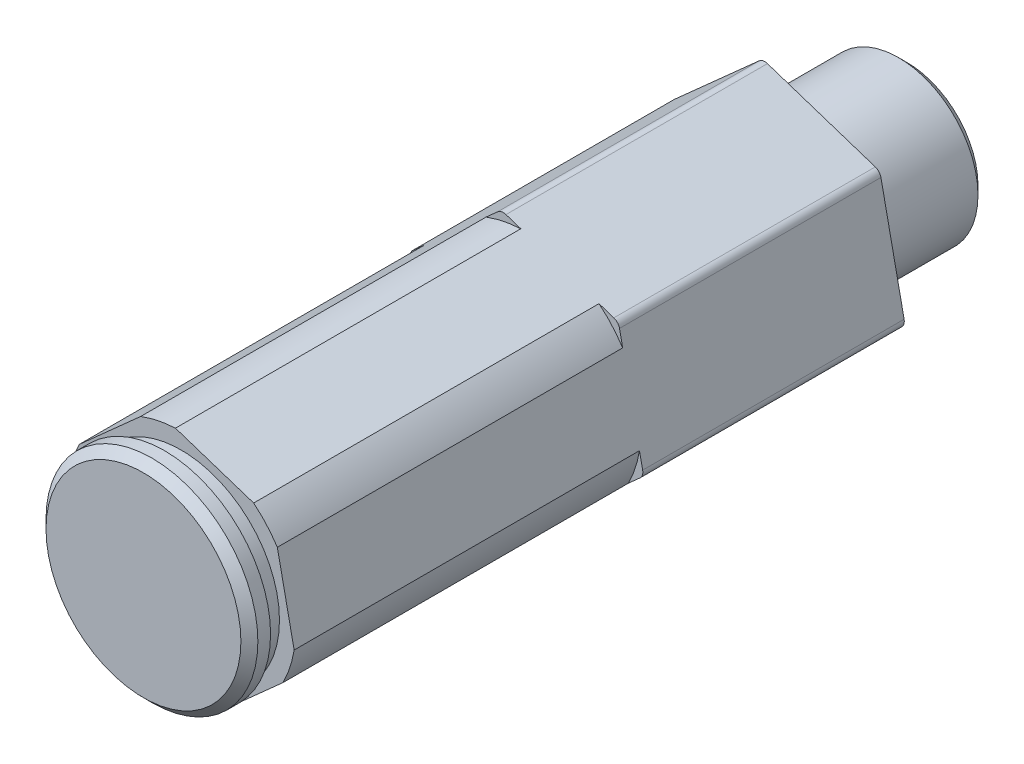
ISO-10303-21;
HEADER;
FILE_DESCRIPTION(('STEP AP214'),'2;1');
FILE_NAME('part.step','',(''),(''),'','','');
FILE_SCHEMA(('AUTOMOTIVE_DESIGN { 1 0 10303 214 1 1 1 1 }'));
ENDSEC;
DATA;
#1=APPLICATION_CONTEXT('core data for automotive mechanical design processes');
#2=APPLICATION_PROTOCOL_DEFINITION('international standard','automotive_design',2000,#1);
#3=PRODUCT_CONTEXT('',#1,'mechanical');
#4=PRODUCT('Part','Part','',(#3));
#5=PRODUCT_RELATED_PRODUCT_CATEGORY('part','',(#4));
#6=PRODUCT_DEFINITION_FORMATION('','',#4);
#7=PRODUCT_DEFINITION_CONTEXT('part definition',#1,'design');
#8=PRODUCT_DEFINITION('design','',#6,#7);
#9=PRODUCT_DEFINITION_SHAPE('','',#8);
#10=(LENGTH_UNIT() NAMED_UNIT(*) SI_UNIT(.MILLI.,.METRE.));
#11=(NAMED_UNIT(*) PLANE_ANGLE_UNIT() SI_UNIT($,.RADIAN.));
#12=(NAMED_UNIT(*) SI_UNIT($,.STERADIAN.) SOLID_ANGLE_UNIT());
#13=UNCERTAINTY_MEASURE_WITH_UNIT(LENGTH_MEASURE(1.E-05),#10,'distance_accuracy_value','');
#14=(GEOMETRIC_REPRESENTATION_CONTEXT(3) GLOBAL_UNCERTAINTY_ASSIGNED_CONTEXT((#13)) GLOBAL_UNIT_ASSIGNED_CONTEXT((#10,
#11,#12)) REPRESENTATION_CONTEXT('',''));
#15=CARTESIAN_POINT('',(0.,0.,0.));
#16=DIRECTION('',(0.,0.,1.));
#17=DIRECTION('',(1.,0.,0.));
#18=AXIS2_PLACEMENT_3D('',#15,#16,#17);
#19=CARTESIAN_POINT('',(0.,0.,6.49750361445784));
#20=DIRECTION('',(0.,0.,1.));
#21=DIRECTION('',(1.,0.,0.));
#22=AXIS2_PLACEMENT_3D('',#19,#20,#21);
#23=CYLINDRICAL_SURFACE('',#22,6.862299966);
#24=CARTESIAN_POINT('',(0.,0.,-0.0761999999999985));
#25=DIRECTION('',(0.,0.,-1.));
#26=DIRECTION('',(-1.,0.,0.));
#27=AXIS2_PLACEMENT_3D('',#24,#25,#26);
#28=CIRCLE('',#27,6.862299966);
#29=CARTESIAN_POINT('',(2.4264465991276,-6.41899662914273,-0.0761999999999985));
#30=VERTEX_POINT('',#29);
#31=CARTESIAN_POINT('',(0.34174376616808,-6.8537852331138,-0.0761999999999985));
#32=VERTEX_POINT('',#31);
#33=EDGE_CURVE('E394',#30,#32,#28,.T.);
#34=ORIENTED_EDGE('',*,*,#33,.F.);
#35=DIRECTION('',(0.,0.,1.));
#36=VECTOR('',#35,1.);
#37=CARTESIAN_POINT('',(2.4264465991276,-6.41899662914273,6.49750361445784));
#38=LINE('',#37,#36);
#39=CARTESIAN_POINT('',(2.4264465991276,-6.41899662914273,20.6248));
#40=VERTEX_POINT('',#39);
#41=EDGE_CURVE('E220',#40,#30,#38,.F.);
#42=ORIENTED_EDGE('',*,*,#41,.F.);
#43=CARTESIAN_POINT('',(0.,0.,20.6248));
#44=DIRECTION('',(0.,0.,1.));
#45=DIRECTION('',(1.,0.,0.));
#46=AXIS2_PLACEMENT_3D('',#43,#44,#45);
#47=CIRCLE('',#46,6.86229996599999);
#48=CARTESIAN_POINT('',(0.341743766168077,-6.8537852331138,20.6248));
#49=VERTEX_POINT('',#48);
#50=EDGE_CURVE('E474',#49,#40,#47,.T.);
#51=ORIENTED_EDGE('',*,*,#50,.F.);
#52=DIRECTION('',(0.,0.,1.));
#53=VECTOR('',#52,1.);
#54=CARTESIAN_POINT('',(0.341743766168077,-6.8537852331138,6.49750361445784));
#55=LINE('',#54,#53);
#56=EDGE_CURVE('E432',#32,#49,#55,.T.);
#57=ORIENTED_EDGE('',*,*,#56,.F.);
#58=EDGE_LOOP('',(#34,#42,#51,#57));
#59=FACE_BOUND('',#58,.T.);
#60=ADVANCED_FACE('F46',(#59),#23,.T.);
#61=CARTESIAN_POINT('',(0.,0.,-0.0761999999999985));
#62=DIRECTION('',(0.,0.,-1.));
#63=DIRECTION('',(-1.,0.,0.));
#64=AXIS2_PLACEMENT_3D('',#61,#62,#63);
#65=CIRCLE('',#64,6.862299966);
#66=CARTESIAN_POINT('',(-4.34579084808048,-5.31086271034222,-0.0761999999999985));
#67=VERTEX_POINT('',#66);
#68=CARTESIAN_POINT('',(-5.76468024087516,-3.72285139964344,-0.0761999999999985));
#69=VERTEX_POINT('',#68);
#70=EDGE_CURVE('E281',#67,#69,#65,.T.);
#71=ORIENTED_EDGE('',*,*,#70,.F.);
#72=DIRECTION('',(0.,0.,1.));
#73=VECTOR('',#72,1.);
#74=CARTESIAN_POINT('',(-4.34579084808048,-5.31086271034222,6.49750361445784));
#75=LINE('',#74,#73);
#76=CARTESIAN_POINT('',(-4.34579084808048,-5.31086271034222,20.6248));
#77=VERTEX_POINT('',#76);
#78=EDGE_CURVE('E388',#77,#67,#75,.F.);
#79=ORIENTED_EDGE('',*,*,#78,.F.);
#80=CARTESIAN_POINT('',(-5.76468024087516,-3.72285139964343,20.6248));
#81=VERTEX_POINT('',#80);
#82=EDGE_CURVE('E476',#81,#77,#47,.T.);
#83=ORIENTED_EDGE('',*,*,#82,.F.);
#84=DIRECTION('',(0.,0.,1.));
#85=VECTOR('',#84,1.);
#86=CARTESIAN_POINT('',(-5.76468024087516,-3.72285139964343,6.49750361445784));
#87=LINE('',#86,#85);
#88=EDGE_CURVE('E393',#69,#81,#87,.T.);
#89=ORIENTED_EDGE('',*,*,#88,.F.);
#90=EDGE_LOOP('',(#71,#79,#83,#89));
#91=FACE_BOUND('',#90,.T.);
#92=ADVANCED_FACE('F390',(#91),#23,.T.);
#93=CARTESIAN_POINT('',(0.,0.,-0.0761999999999985));
#94=DIRECTION('',(0.,0.,-1.));
#95=DIRECTION('',(-1.,0.,0.));
#96=AXIS2_PLACEMENT_3D('',#93,#94,#95);
#97=CIRCLE('',#96,6.862299966);
#98=CARTESIAN_POINT('',(-6.77223744720808,1.10813391880051,-0.0761999999999985));
#99=VERTEX_POINT('',#98);
#100=CARTESIAN_POINT('',(-6.10642400704325,3.13093383347037,-0.0761999999999985));
#101=VERTEX_POINT('',#100);
#102=EDGE_CURVE('E395',#99,#101,#97,.T.);
#103=ORIENTED_EDGE('',*,*,#102,.F.);
#104=DIRECTION('',(0.,0.,1.));
#105=VECTOR('',#104,1.);
#106=CARTESIAN_POINT('',(-6.77223744720808,1.10813391880051,6.49750361445784));
#107=LINE('',#106,#105);
#108=CARTESIAN_POINT('',(-6.77223744720808,1.10813391880051,20.6248));
#109=VERTEX_POINT('',#108);
#110=EDGE_CURVE('E426',#109,#99,#107,.F.);
#111=ORIENTED_EDGE('',*,*,#110,.F.);
#112=CARTESIAN_POINT('',(-6.10642400704324,3.13093383347037,20.6248));
#113=VERTEX_POINT('',#112);
#114=EDGE_CURVE('E480',#113,#109,#47,.T.);
#115=ORIENTED_EDGE('',*,*,#114,.F.);
#116=DIRECTION('',(0.,0.,1.));
#117=VECTOR('',#116,1.);
#118=CARTESIAN_POINT('',(-6.10642400704324,3.13093383347037,6.49750361445784));
#119=LINE('',#118,#117);
#120=EDGE_CURVE('E422',#101,#113,#119,.T.);
#121=ORIENTED_EDGE('',*,*,#120,.F.);
#122=EDGE_LOOP('',(#103,#111,#115,#121));
#123=FACE_BOUND('',#122,.T.);
#124=ADVANCED_FACE('F502',(#123),#23,.T.);
#125=CARTESIAN_POINT('',(0.,0.,-0.0761999999999985));
#126=DIRECTION('',(0.,0.,-1.));
#127=DIRECTION('',(-1.,0.,0.));
#128=AXIS2_PLACEMENT_3D('',#125,#126,#127);
#129=CIRCLE('',#128,6.862299966);
#130=CARTESIAN_POINT('',(-2.42644659912759,6.41899662914273,-0.0761999999999985));
#131=VERTEX_POINT('',#130);
#132=CARTESIAN_POINT('',(-0.341743766168094,6.85378523311381,-0.0761999999999985));
#133=VERTEX_POINT('',#132);
#134=EDGE_CURVE('E245',#131,#133,#129,.T.);
#135=ORIENTED_EDGE('',*,*,#134,.F.);
#136=DIRECTION('',(0.,0.,1.));
#137=VECTOR('',#136,1.);
#138=CARTESIAN_POINT('',(-2.42644659912759,6.41899662914273,6.49750361445784));
#139=LINE('',#138,#137);
#140=CARTESIAN_POINT('',(-2.42644659912759,6.41899662914273,20.6248));
#141=VERTEX_POINT('',#140);
#142=EDGE_CURVE('E419',#141,#131,#139,.F.);
#143=ORIENTED_EDGE('',*,*,#142,.F.);
#144=CARTESIAN_POINT('',(-0.341743766168078,6.8537852331138,20.6248));
#145=VERTEX_POINT('',#144);
#146=EDGE_CURVE('E442',#145,#141,#47,.T.);
#147=ORIENTED_EDGE('',*,*,#146,.F.);
#148=DIRECTION('',(0.,0.,1.));
#149=VECTOR('',#148,1.);
#150=CARTESIAN_POINT('',(-0.341743766168078,6.8537852331138,6.49750361445784));
#151=LINE('',#150,#149);
#152=EDGE_CURVE('E414',#133,#145,#151,.T.);
#153=ORIENTED_EDGE('',*,*,#152,.F.);
#154=EDGE_LOOP('',(#135,#143,#147,#153));
#155=FACE_BOUND('',#154,.T.);
#156=ADVANCED_FACE('F509',(#155),#23,.T.);
#157=CARTESIAN_POINT('',(0.,0.,-0.0761999999999985));
#158=DIRECTION('',(0.,0.,-1.));
#159=DIRECTION('',(-1.,0.,0.));
#160=AXIS2_PLACEMENT_3D('',#157,#158,#159);
#161=CIRCLE('',#160,6.862299966);
#162=CARTESIAN_POINT('',(4.34579084808048,5.31086271034222,-0.0761999999999985));
#163=VERTEX_POINT('',#162);
#164=CARTESIAN_POINT('',(5.76468024087516,3.72285139964344,-0.0761999999999985));
#165=VERTEX_POINT('',#164);
#166=EDGE_CURVE('E225',#163,#165,#161,.T.);
#167=ORIENTED_EDGE('',*,*,#166,.F.);
#168=DIRECTION('',(0.,0.,1.));
#169=VECTOR('',#168,1.);
#170=CARTESIAN_POINT('',(4.34579084808048,5.31086271034222,6.49750361445784));
#171=LINE('',#170,#169);
#172=CARTESIAN_POINT('',(4.34579084808048,5.31086271034222,20.6248));
#173=VERTEX_POINT('',#172);
#174=EDGE_CURVE('E411',#173,#163,#171,.F.);
#175=ORIENTED_EDGE('',*,*,#174,.F.);
#176=CARTESIAN_POINT('',(5.76468024087516,3.72285139964343,20.6248));
#177=VERTEX_POINT('',#176);
#178=EDGE_CURVE('E439',#177,#173,#47,.T.);
#179=ORIENTED_EDGE('',*,*,#178,.F.);
#180=DIRECTION('',(0.,0.,1.));
#181=VECTOR('',#180,1.);
#182=CARTESIAN_POINT('',(5.76468024087516,3.72285139964343,6.49750361445784));
#183=LINE('',#182,#181);
#184=EDGE_CURVE('E405',#165,#177,#183,.T.);
#185=ORIENTED_EDGE('',*,*,#184,.F.);
#186=EDGE_LOOP('',(#167,#175,#179,#185));
#187=FACE_BOUND('',#186,.T.);
#188=ADVANCED_FACE('F505',(#187),#23,.T.);
#189=CARTESIAN_POINT('',(0.,0.,-0.0761999999999985));
#190=DIRECTION('',(0.,0.,-1.));
#191=DIRECTION('',(-1.,0.,0.));
#192=AXIS2_PLACEMENT_3D('',#189,#190,#191);
#193=CIRCLE('',#192,6.862299966);
#194=CARTESIAN_POINT('',(6.77223744720808,-1.10813391880051,-0.0761999999999985));
#195=VERTEX_POINT('',#194);
#196=CARTESIAN_POINT('',(6.10642400704324,-3.13093383347037,-0.0761999999999985));
#197=VERTEX_POINT('',#196);
#198=EDGE_CURVE('E212',#195,#197,#193,.T.);
#199=ORIENTED_EDGE('',*,*,#198,.F.);
#200=DIRECTION('',(0.,0.,1.));
#201=VECTOR('',#200,1.);
#202=CARTESIAN_POINT('',(6.77223744720808,-1.10813391880051,6.49750361445784));
#203=LINE('',#202,#201);
#204=CARTESIAN_POINT('',(6.77223744720808,-1.10813391880051,20.6248));
#205=VERTEX_POINT('',#204);
#206=EDGE_CURVE('E403',#205,#195,#203,.F.);
#207=ORIENTED_EDGE('',*,*,#206,.F.);
#208=CARTESIAN_POINT('',(6.10642400704324,-3.13093383347038,20.6248));
#209=VERTEX_POINT('',#208);
#210=EDGE_CURVE('E215',#209,#205,#47,.T.);
#211=ORIENTED_EDGE('',*,*,#210,.F.);
#212=DIRECTION('',(0.,0.,1.));
#213=VECTOR('',#212,1.);
#214=CARTESIAN_POINT('',(6.10642400704324,-3.13093383347038,6.49750361445784));
#215=LINE('',#214,#213);
#216=EDGE_CURVE('E208',#197,#209,#215,.T.);
#217=ORIENTED_EDGE('',*,*,#216,.F.);
#218=EDGE_LOOP('',(#199,#207,#211,#217));
#219=FACE_BOUND('',#218,.T.);
#220=ADVANCED_FACE('F210',(#219),#23,.T.);
#221=CARTESIAN_POINT('',(0.,6.86229996599999,20.6248));
#222=DIRECTION('',(0.,0.,-1.));
#223=DIRECTION('',(-1.,0.,0.));
#224=AXIS2_PLACEMENT_3D('',#221,#222,#223);
#225=PLANE('',#224);
#226=CARTESIAN_POINT('',(0.,0.,20.6248));
#227=DIRECTION('',(0.,0.,1.));
#228=DIRECTION('',(1.,0.,0.));
#229=AXIS2_PLACEMENT_3D('',#226,#227,#228);
#230=CIRCLE('',#229,5.8928);
#231=CARTESIAN_POINT('',(5.8928,0.,20.6248));
#232=VERTEX_POINT('',#231);
#233=EDGE_CURVE('E441',#232,#232,#230,.T.);
#234=ORIENTED_EDGE('',*,*,#233,.F.);
#235=EDGE_LOOP('',(#234));
#236=FACE_BOUND('',#235,.T.);
#237=DIRECTION('',(-0.949867408528676,0.312653012483517,0.));
#238=VECTOR('',#237,1.);
#239=CARTESIAN_POINT('',(-4.03998188255613,-5.41152106903226,20.6248));
#240=LINE('',#239,#238);
#241=EDGE_CURVE('E434',#49,#77,#240,.T.);
#242=ORIENTED_EDGE('',*,*,#241,.F.);
#243=ORIENTED_EDGE('',*,*,#50,.T.);
#244=DIRECTION('',(-0.745699155644796,-0.666282799770966,0.));
#245=VECTOR('',#244,1.);
#246=CARTESIAN_POINT('',(7.67594516869106,-1.72856540383437,20.6248));
#247=LINE('',#246,#245);
#248=EDGE_CURVE('E219',#209,#40,#247,.T.);
#249=ORIENTED_EDGE('',*,*,#248,.F.);
#250=ORIENTED_EDGE('',*,*,#210,.T.);
#251=DIRECTION('',(0.204168252883879,-0.978935812254483,0.));
#252=VECTOR('',#251,1.);
#253=CARTESIAN_POINT('',(4.8969073200359,7.88360595925352,20.6248));
#254=LINE('',#253,#252);
#255=EDGE_CURVE('E407',#177,#205,#254,.T.);
#256=ORIENTED_EDGE('',*,*,#255,.F.);
#257=ORIENTED_EDGE('',*,*,#178,.T.);
#258=DIRECTION('',(0.949867408528676,-0.312653012483516,0.));
#259=VECTOR('',#258,1.);
#260=CARTESIAN_POINT('',(-0.0359348006437236,6.75312687442376,20.6248));
#261=LINE('',#260,#259);
#262=EDGE_CURVE('E415',#145,#173,#261,.T.);
#263=ORIENTED_EDGE('',*,*,#262,.F.);
#264=ORIENTED_EDGE('',*,*,#146,.T.);
#265=DIRECTION('',(0.745699155644796,0.666282799770966,0.));
#266=VECTOR('',#265,1.);
#267=CARTESIAN_POINT('',(-0.856925437479777,7.82136505877873,20.6248));
#268=LINE('',#267,#266);
#269=EDGE_CURVE('E424',#113,#141,#268,.T.);
#270=ORIENTED_EDGE('',*,*,#269,.F.);
#271=ORIENTED_EDGE('',*,*,#114,.T.);
#272=DIRECTION('',(-0.204168252883879,0.978935812254483,0.));
#273=VECTOR('',#272,1.);
#274=CARTESIAN_POINT('',(-7.64001036804734,5.2688884784106,20.6248));
#275=LINE('',#274,#273);
#276=EDGE_CURVE('E429',#81,#109,#275,.T.);
#277=ORIENTED_EDGE('',*,*,#276,.F.);
#278=ORIENTED_EDGE('',*,*,#82,.T.);
#279=EDGE_LOOP('',(#242,#243,#249,#250,#256,#257,#263,#264,#270,#271,#277,#278));
#280=FACE_BOUND('',#279,.T.);
#281=ADVANCED_FACE('F467',(#236,#280),#225,.F.);
#282=CARTESIAN_POINT('',(0.,4.7625,-15.748));
#283=DIRECTION('',(0.,0.,1.));
#284=DIRECTION('',(1.,0.,0.));
#285=AXIS2_PLACEMENT_3D('',#282,#283,#284);
#286=PLANE('',#285);
#287=CARTESIAN_POINT('',(0.,0.,-15.748));
#288=DIRECTION('',(0.,0.,1.));
#289=DIRECTION('',(1.,0.,0.));
#290=AXIS2_PLACEMENT_3D('',#287,#288,#289);
#291=CIRCLE('',#290,4.7625);
#292=CARTESIAN_POINT('',(4.7625,0.,-15.748));
#293=VERTEX_POINT('',#292);
#294=EDGE_CURVE('E436',#293,#293,#291,.T.);
#295=ORIENTED_EDGE('',*,*,#294,.T.);
#296=EDGE_LOOP('',(#295));
#297=FACE_BOUND('',#296,.T.);
#298=DIRECTION('',(0.745699155644796,0.666282799770966,0.));
#299=VECTOR('',#298,1.);
#300=CARTESIAN_POINT('',(6.63266686034738,-2.66073541765514,-15.748));
#301=LINE('',#300,#299);
#302=CARTESIAN_POINT('',(1.72831688240845,-7.04277609669051,-15.748));
#303=VERTEX_POINT('',#302);
#304=CARTESIAN_POINT('',(6.80455372376239,-2.50715436592259,-15.748));
#305=VERTEX_POINT('',#304);
#306=EDGE_CURVE('E311',#303,#305,#301,.T.);
#307=ORIENTED_EDGE('',*,*,#306,.F.);
#308=CARTESIAN_POINT('',(1.3898452201248,-6.66396092562296,-15.748));
#309=DIRECTION('',(0.,0.,1.));
#310=DIRECTION('',(1.,0.,0.));
#311=AXIS2_PLACEMENT_3D('',#308,#309,#310);
#312=CIRCLE('',#311,0.508);
#313=CARTESIAN_POINT('',(1.23101748978317,-7.14649356915553,-15.748));
#314=VERTEX_POINT('',#313);
#315=EDGE_CURVE('E355',#303,#314,#312,.F.);
#316=ORIENTED_EDGE('',*,*,#315,.T.);
#317=DIRECTION('',(0.949867408528676,-0.312653012483517,0.));
#318=VECTOR('',#317,1.);
#319=CARTESIAN_POINT('',(-3.41638558428831,-5.61678051837899,-15.748));
#320=LINE('',#319,#318);
#321=CARTESIAN_POINT('',(-5.23506457169557,-5.0181543743005,-15.748));
#322=VERTEX_POINT('',#321);
#323=EDGE_CURVE('E326',#322,#314,#320,.T.);
#324=ORIENTED_EDGE('',*,*,#323,.F.);
#325=CARTESIAN_POINT('',(-5.07623684135394,-4.53562173076793,-15.748));
#326=DIRECTION('',(0.,0.,1.));
#327=DIRECTION('',(1.,0.,0.));
#328=AXIS2_PLACEMENT_3D('',#325,#326,#327);
#329=CIRCLE('',#328,0.508);
#330=CARTESIAN_POINT('',(-5.57353623397922,-4.63933920323294,-15.748));
#331=VERTEX_POINT('',#330);
#332=EDGE_CURVE('E349',#322,#331,#329,.F.);
#333=ORIENTED_EDGE('',*,*,#332,.T.);
#334=DIRECTION('',(0.204168252883879,-0.978935812254483,0.));
#335=VECTOR('',#334,1.);
#336=CARTESIAN_POINT('',(-7.22032835797147,3.25661799257811,-15.748));
#337=LINE('',#336,#335);
#338=CARTESIAN_POINT('',(-6.96338145410402,2.02462172239002,-15.748));
#339=VERTEX_POINT('',#338);
#340=EDGE_CURVE('E323',#339,#331,#337,.T.);
#341=ORIENTED_EDGE('',*,*,#340,.F.);
#342=CARTESIAN_POINT('',(-6.46608206147874,2.12833919485503,-15.748));
#343=DIRECTION('',(0.,0.,1.));
#344=DIRECTION('',(1.,0.,0.));
#345=AXIS2_PLACEMENT_3D('',#342,#343,#344);
#346=CIRCLE('',#345,0.508);
#347=CARTESIAN_POINT('',(-6.80455372376239,2.50715436592259,-15.748));
#348=VERTEX_POINT('',#347);
#349=EDGE_CURVE('E351',#339,#348,#346,.F.);
#350=ORIENTED_EDGE('',*,*,#349,.T.);
#351=DIRECTION('',(-0.745699155644796,-0.666282799770966,0.));
#352=VECTOR('',#351,1.);
#353=CARTESIAN_POINT('',(-1.90020374582346,6.88919504495796,-15.748));
#354=LINE('',#353,#352);
#355=CARTESIAN_POINT('',(-1.72831688240845,7.04277609669051,-15.748));
#356=VERTEX_POINT('',#355);
#357=EDGE_CURVE('E315',#356,#348,#354,.T.);
#358=ORIENTED_EDGE('',*,*,#357,.F.);
#359=CARTESIAN_POINT('',(-1.3898452201248,6.66396092562296,-15.748));
#360=DIRECTION('',(0.,0.,1.));
#361=DIRECTION('',(1.,0.,0.));
#362=AXIS2_PLACEMENT_3D('',#359,#360,#361);
#363=CIRCLE('',#362,0.508);
#364=CARTESIAN_POINT('',(-1.23101748978317,7.14649356915552,-15.748));
#365=VERTEX_POINT('',#364);
#366=EDGE_CURVE('E353',#356,#365,#363,.F.);
#367=ORIENTED_EDGE('',*,*,#366,.T.);
#368=DIRECTION('',(-0.949867408528676,0.312653012483516,0.));
#369=VECTOR('',#368,1.);
#370=CARTESIAN_POINT('',(0.587661497624088,6.54786742507703,-15.748));
#371=LINE('',#370,#369);
#372=CARTESIAN_POINT('',(5.23506457169557,5.0181543743005,-15.748));
#373=VERTEX_POINT('',#372);
#374=EDGE_CURVE('E310',#373,#365,#371,.T.);
#375=ORIENTED_EDGE('',*,*,#374,.F.);
#376=CARTESIAN_POINT('',(5.07623684135394,4.53562173076793,-15.748));
#377=DIRECTION('',(0.,0.,1.));
#378=DIRECTION('',(1.,0.,0.));
#379=AXIS2_PLACEMENT_3D('',#376,#377,#378);
#380=CIRCLE('',#379,0.508);
#381=CARTESIAN_POINT('',(5.57353623397922,4.63933920323294,-15.748));
#382=VERTEX_POINT('',#381);
#383=EDGE_CURVE('E309',#373,#382,#380,.F.);
#384=ORIENTED_EDGE('',*,*,#383,.T.);
#385=DIRECTION('',(-0.204168252883879,0.978935812254483,0.));
#386=VECTOR('',#385,1.);
#387=CARTESIAN_POINT('',(5.31658933011177,5.87133547342102,-15.748));
#388=LINE('',#387,#386);
#389=CARTESIAN_POINT('',(6.96338145410402,-2.02462172239002,-15.748));
#390=VERTEX_POINT('',#389);
#391=EDGE_CURVE('E302',#390,#382,#388,.T.);
#392=ORIENTED_EDGE('',*,*,#391,.F.);
#393=CARTESIAN_POINT('',(6.46608206147874,-2.12833919485503,-15.748));
#394=DIRECTION('',(0.,0.,1.));
#395=DIRECTION('',(1.,0.,0.));
#396=AXIS2_PLACEMENT_3D('',#393,#394,#395);
#397=CIRCLE('',#396,0.508);
#398=EDGE_CURVE('E307',#390,#305,#397,.F.);
#399=ORIENTED_EDGE('',*,*,#398,.T.);
#400=EDGE_LOOP('',(#307,#316,#324,#333,#341,#350,#358,#367,#375,#384,#392,#399));
#401=FACE_BOUND('',#400,.T.);
#402=ADVANCED_FACE('F306',(#297,#401),#286,.F.);
#403=CARTESIAN_POINT('',(0.,6.35,22.8854));
#404=DIRECTION('',(0.,0.,-1.));
#405=DIRECTION('',(-1.,0.,0.));
#406=AXIS2_PLACEMENT_3D('',#403,#404,#405);
#407=PLANE('',#406);
#408=CARTESIAN_POINT('',(0.,0.,22.8854));
#409=DIRECTION('',(0.,0.,-1.));
#410=DIRECTION('',(-1.,0.,0.));
#411=AXIS2_PLACEMENT_3D('',#408,#409,#410);
#412=CIRCLE('',#411,5.842);
#413=CARTESIAN_POINT('',(-5.842,0.,22.8854));
#414=VERTEX_POINT('',#413);
#415=EDGE_CURVE('E335',#414,#414,#412,.F.);
#416=ORIENTED_EDGE('',*,*,#415,.T.);
#417=EDGE_LOOP('',(#416));
#418=FACE_BOUND('',#417,.T.);
#419=ADVANCED_FACE('F560',(#418),#407,.F.);
#420=CARTESIAN_POINT('',(0.,0.,6.49750361445784));
#421=DIRECTION('',(0.,0.,1.));
#422=DIRECTION('',(1.,0.,0.));
#423=AXIS2_PLACEMENT_3D('',#420,#421,#422);
#424=CYLINDRICAL_SURFACE('',#423,6.35);
#425=CARTESIAN_POINT('',(0.,0.,22.3774));
#426=DIRECTION('',(0.,0.,-1.));
#427=DIRECTION('',(-1.,0.,0.));
#428=AXIS2_PLACEMENT_3D('',#425,#426,#427);
#429=CIRCLE('',#428,6.35);
#430=CARTESIAN_POINT('',(-6.35,0.,22.3774));
#431=VERTEX_POINT('',#430);
#432=EDGE_CURVE('E338',#431,#431,#429,.T.);
#433=ORIENTED_EDGE('',*,*,#432,.T.);
#434=EDGE_LOOP('',(#433));
#435=FACE_BOUND('',#434,.T.);
#436=CARTESIAN_POINT('',(0.,0.,21.6154));
#437=DIRECTION('',(0.,0.,1.));
#438=DIRECTION('',(1.,0.,0.));
#439=AXIS2_PLACEMENT_3D('',#436,#437,#438);
#440=CIRCLE('',#439,6.35);
#441=CARTESIAN_POINT('',(6.35,0.,21.6154));
#442=VERTEX_POINT('',#441);
#443=EDGE_CURVE('E316',#442,#442,#440,.T.);
#444=ORIENTED_EDGE('',*,*,#443,.T.);
#445=EDGE_LOOP('',(#444));
#446=FACE_BOUND('',#445,.T.);
#447=ADVANCED_FACE('F452',(#435,#446),#424,.T.);
#448=CARTESIAN_POINT('',(0.,5.8928,21.6154));
#449=DIRECTION('',(0.,0.,1.));
#450=DIRECTION('',(1.,0.,0.));
#451=AXIS2_PLACEMENT_3D('',#448,#449,#450);
#452=PLANE('',#451);
#453=ORIENTED_EDGE('',*,*,#443,.F.);
#454=EDGE_LOOP('',(#453));
#455=FACE_BOUND('',#454,.T.);
#456=CARTESIAN_POINT('',(0.,0.,21.6154));
#457=DIRECTION('',(0.,0.,1.));
#458=DIRECTION('',(1.,0.,0.));
#459=AXIS2_PLACEMENT_3D('',#456,#457,#458);
#460=CIRCLE('',#459,5.8928);
#461=CARTESIAN_POINT('',(5.8928,0.,21.6154));
#462=VERTEX_POINT('',#461);
#463=EDGE_CURVE('E447',#462,#462,#460,.T.);
#464=ORIENTED_EDGE('',*,*,#463,.T.);
#465=EDGE_LOOP('',(#464));
#466=FACE_BOUND('',#465,.T.);
#467=ADVANCED_FACE('F454',(#455,#466),#452,.F.);
#468=CARTESIAN_POINT('',(0.,0.,6.49750361445784));
#469=DIRECTION('',(0.,0.,1.));
#470=DIRECTION('',(1.,0.,0.));
#471=AXIS2_PLACEMENT_3D('',#468,#469,#470);
#472=CYLINDRICAL_SURFACE('',#471,5.8928);
#473=ORIENTED_EDGE('',*,*,#463,.F.);
#474=EDGE_LOOP('',(#473));
#475=FACE_BOUND('',#474,.T.);
#476=ORIENTED_EDGE('',*,*,#233,.T.);
#477=EDGE_LOOP('',(#476));
#478=FACE_BOUND('',#477,.T.);
#479=ADVANCED_FACE('F457',(#475,#478),#472,.T.);
#480=CARTESIAN_POINT('',(0.,0.,6.49750361445784));
#481=DIRECTION('',(0.,0.,1.));
#482=DIRECTION('',(1.,0.,0.));
#483=AXIS2_PLACEMENT_3D('',#480,#481,#482);
#484=CYLINDRICAL_SURFACE('',#483,4.7625);
#485=CARTESIAN_POINT('',(0.,0.,-22.3774));
#486=DIRECTION('',(0.,0.,1.));
#487=DIRECTION('',(1.,0.,0.));
#488=AXIS2_PLACEMENT_3D('',#485,#486,#487);
#489=CIRCLE('',#488,4.7625);
#490=CARTESIAN_POINT('',(4.7625,0.,-22.3774));
#491=VERTEX_POINT('',#490);
#492=EDGE_CURVE('E329',#491,#491,#489,.T.);
#493=ORIENTED_EDGE('',*,*,#492,.T.);
#494=EDGE_LOOP('',(#493));
#495=FACE_BOUND('',#494,.T.);
#496=ORIENTED_EDGE('',*,*,#294,.F.);
#497=EDGE_LOOP('',(#496));
#498=FACE_BOUND('',#497,.T.);
#499=ADVANCED_FACE('F463',(#495,#498),#484,.T.);
#500=CARTESIAN_POINT('',(0.,4.7625,-22.8854));
#501=DIRECTION('',(0.,0.,1.));
#502=DIRECTION('',(1.,0.,0.));
#503=AXIS2_PLACEMENT_3D('',#500,#501,#502);
#504=PLANE('',#503);
#505=CARTESIAN_POINT('',(0.,0.,-22.8854));
#506=DIRECTION('',(0.,0.,1.));
#507=DIRECTION('',(1.,0.,0.));
#508=AXIS2_PLACEMENT_3D('',#505,#506,#507);
#509=CIRCLE('',#508,4.2545);
#510=CARTESIAN_POINT('',(4.2545,0.,-22.8854));
#511=VERTEX_POINT('',#510);
#512=EDGE_CURVE('E332',#511,#511,#509,.F.);
#513=ORIENTED_EDGE('',*,*,#512,.T.);
#514=EDGE_LOOP('',(#513));
#515=FACE_BOUND('',#514,.T.);
#516=ADVANCED_FACE('F591',(#515),#504,.F.);
#517=CARTESIAN_POINT('',(1.50960784141948,-7.23819280202304,-22.8854));
#518=DIRECTION('',(0.666282799770966,-0.745699155644796,0.));
#519=DIRECTION('',(0.745699155644796,0.666282799770966,0.));
#520=AXIS2_PLACEMENT_3D('',#517,#518,#519);
#521=PLANE('',#520);
#522=DIRECTION('',(0.745699155644796,0.666282799770967,0.));
#523=VECTOR('',#522,1.);
#524=CARTESIAN_POINT('',(7.02326276475136,-2.31173766059006,-0.0761999999999985));
#525=LINE('',#524,#523);
#526=CARTESIAN_POINT('',(1.72831688240845,-7.04277609669052,-0.0761999999999985));
#527=VERTEX_POINT('',#526);
#528=EDGE_CURVE('E233',#527,#30,#525,.T.);
#529=ORIENTED_EDGE('',*,*,#528,.F.);
#530=DIRECTION('',(0.,0.,-1.));
#531=VECTOR('',#530,1.);
#532=CARTESIAN_POINT('',(1.72831688240845,-7.04277609669052,-22.8854));
#533=LINE('',#532,#531);
#534=EDGE_CURVE('E344',#527,#303,#533,.T.);
#535=ORIENTED_EDGE('',*,*,#534,.T.);
#536=ORIENTED_EDGE('',*,*,#306,.T.);
#537=DIRECTION('',(0.,0.,-1.));
#538=VECTOR('',#537,1.);
#539=CARTESIAN_POINT('',(6.80455372376239,-2.50715436592259,-22.8854));
#540=LINE('',#539,#538);
#541=CARTESIAN_POINT('',(6.80455372376239,-2.50715436592259,-0.0761999999999985));
#542=VERTEX_POINT('',#541);
#543=EDGE_CURVE('E232',#305,#542,#540,.F.);
#544=ORIENTED_EDGE('',*,*,#543,.T.);
#545=EDGE_CURVE('E223',#197,#542,#525,.T.);
#546=ORIENTED_EDGE('',*,*,#545,.F.);
#547=ORIENTED_EDGE('',*,*,#216,.T.);
#548=ORIENTED_EDGE('',*,*,#248,.T.);
#549=ORIENTED_EDGE('',*,*,#41,.T.);
#550=EDGE_LOOP('',(#529,#535,#536,#544,#546,#547,#548,#549));
#551=FACE_BOUND('',#550,.T.);
#552=ADVANCED_FACE('F229',(#551),#521,.T.);
#553=CARTESIAN_POINT('',(7.02326276475136,-2.31173766059006,-22.8854));
#554=DIRECTION('',(0.978935812254483,0.204168252883879,0.));
#555=DIRECTION('',(-0.204168252883879,0.978935812254483,0.));
#556=AXIS2_PLACEMENT_3D('',#553,#554,#555);
#557=PLANE('',#556);
#558=DIRECTION('',(-0.20416825288388,0.978935812254483,0.));
#559=VECTOR('',#558,1.);
#560=CARTESIAN_POINT('',(5.51365492333188,4.92645514143298,-0.0761999999999985));
#561=LINE('',#560,#559);
#562=CARTESIAN_POINT('',(6.96338145410402,-2.02462172239002,-0.0761999999999985));
#563=VERTEX_POINT('',#562);
#564=EDGE_CURVE('E224',#563,#195,#561,.T.);
#565=ORIENTED_EDGE('',*,*,#564,.F.);
#566=DIRECTION('',(0.,0.,-1.));
#567=VECTOR('',#566,1.);
#568=CARTESIAN_POINT('',(6.96338145410402,-2.02462172239002,-22.8854));
#569=LINE('',#568,#567);
#570=EDGE_CURVE('E292',#563,#390,#569,.T.);
#571=ORIENTED_EDGE('',*,*,#570,.T.);
#572=ORIENTED_EDGE('',*,*,#391,.T.);
#573=DIRECTION('',(0.,0.,-1.));
#574=VECTOR('',#573,1.);
#575=CARTESIAN_POINT('',(5.57353623397922,4.63933920323294,-22.8854));
#576=LINE('',#575,#574);
#577=CARTESIAN_POINT('',(5.57353623397922,4.63933920323294,-0.0761999999999985));
#578=VERTEX_POINT('',#577);
#579=EDGE_CURVE('E68',#382,#578,#576,.F.);
#580=ORIENTED_EDGE('',*,*,#579,.T.);
#581=EDGE_CURVE('E236',#165,#578,#561,.T.);
#582=ORIENTED_EDGE('',*,*,#581,.F.);
#583=ORIENTED_EDGE('',*,*,#184,.T.);
#584=ORIENTED_EDGE('',*,*,#255,.T.);
#585=ORIENTED_EDGE('',*,*,#206,.T.);
#586=EDGE_LOOP('',(#565,#571,#572,#580,#582,#583,#584,#585));
#587=FACE_BOUND('',#586,.T.);
#588=ADVANCED_FACE('F301',(#587),#557,.T.);
#589=CARTESIAN_POINT('',(5.51365492333188,4.92645514143298,-22.8854));
#590=DIRECTION('',(0.312653012483516,0.949867408528676,0.));
#591=DIRECTION('',(-0.949867408528676,0.312653012483516,0.));
#592=AXIS2_PLACEMENT_3D('',#589,#590,#591);
#593=PLANE('',#592);
#594=ORIENTED_EDGE('',*,*,#374,.T.);
#595=DIRECTION('',(0.,0.,-1.));
#596=VECTOR('',#595,1.);
#597=CARTESIAN_POINT('',(-1.23101748978317,7.14649356915552,-22.8854));
#598=LINE('',#597,#596);
#599=CARTESIAN_POINT('',(-1.23101748978317,7.14649356915552,-0.0761999999999985));
#600=VERTEX_POINT('',#599);
#601=EDGE_CURVE('E370',#365,#600,#598,.F.);
#602=ORIENTED_EDGE('',*,*,#601,.T.);
#603=DIRECTION('',(-0.949867408528676,0.312653012483516,0.));
#604=VECTOR('',#603,1.);
#605=CARTESIAN_POINT('',(-1.50960784141948,7.23819280202304,-0.0761999999999985));
#606=LINE('',#605,#604);
#607=EDGE_CURVE('E260',#133,#600,#606,.T.);
#608=ORIENTED_EDGE('',*,*,#607,.F.);
#609=ORIENTED_EDGE('',*,*,#152,.T.);
#610=ORIENTED_EDGE('',*,*,#262,.T.);
#611=ORIENTED_EDGE('',*,*,#174,.T.);
#612=CARTESIAN_POINT('',(5.23506457169557,5.0181543743005,-0.0761999999999985));
#613=VERTEX_POINT('',#612);
#614=EDGE_CURVE('E257',#613,#163,#606,.T.);
#615=ORIENTED_EDGE('',*,*,#614,.F.);
#616=DIRECTION('',(0.,0.,-1.));
#617=VECTOR('',#616,1.);
#618=CARTESIAN_POINT('',(5.23506457169557,5.0181543743005,-22.8854));
#619=LINE('',#618,#617);
#620=EDGE_CURVE('E367',#613,#373,#619,.T.);
#621=ORIENTED_EDGE('',*,*,#620,.T.);
#622=EDGE_LOOP('',(#594,#602,#608,#609,#610,#611,#615,#621));
#623=FACE_BOUND('',#622,.T.);
#624=ADVANCED_FACE('F520',(#623),#593,.T.);
#625=CARTESIAN_POINT('',(-1.50960784141948,7.23819280202304,-22.8854));
#626=DIRECTION('',(-0.666282799770966,0.745699155644796,0.));
#627=DIRECTION('',(-0.745699155644796,-0.666282799770966,0.));
#628=AXIS2_PLACEMENT_3D('',#625,#626,#627);
#629=PLANE('',#628);
#630=DIRECTION('',(-0.745699155644796,-0.666282799770967,0.));
#631=VECTOR('',#630,1.);
#632=CARTESIAN_POINT('',(-7.02326276475136,2.31173766059006,-0.0761999999999985));
#633=LINE('',#632,#631);
#634=CARTESIAN_POINT('',(-1.72831688240845,7.04277609669051,-0.0761999999999985));
#635=VERTEX_POINT('',#634);
#636=EDGE_CURVE('E261',#635,#131,#633,.T.);
#637=ORIENTED_EDGE('',*,*,#636,.F.);
#638=DIRECTION('',(0.,0.,-1.));
#639=VECTOR('',#638,1.);
#640=CARTESIAN_POINT('',(-1.72831688240845,7.04277609669051,-22.8854));
#641=LINE('',#640,#639);
#642=EDGE_CURVE('E364',#635,#356,#641,.T.);
#643=ORIENTED_EDGE('',*,*,#642,.T.);
#644=ORIENTED_EDGE('',*,*,#357,.T.);
#645=DIRECTION('',(0.,0.,-1.));
#646=VECTOR('',#645,1.);
#647=CARTESIAN_POINT('',(-6.80455372376239,2.50715436592259,-22.8854));
#648=LINE('',#647,#646);
#649=CARTESIAN_POINT('',(-6.80455372376239,2.50715436592259,-0.0761999999999985));
#650=VERTEX_POINT('',#649);
#651=EDGE_CURVE('E362',#348,#650,#648,.F.);
#652=ORIENTED_EDGE('',*,*,#651,.T.);
#653=EDGE_CURVE('E264',#101,#650,#633,.T.);
#654=ORIENTED_EDGE('',*,*,#653,.F.);
#655=ORIENTED_EDGE('',*,*,#120,.T.);
#656=ORIENTED_EDGE('',*,*,#269,.T.);
#657=ORIENTED_EDGE('',*,*,#142,.T.);
#658=EDGE_LOOP('',(#637,#643,#644,#652,#654,#655,#656,#657));
#659=FACE_BOUND('',#658,.T.);
#660=ADVANCED_FACE('F538',(#659),#629,.T.);
#661=CARTESIAN_POINT('',(-7.02326276475136,2.31173766059006,-22.8854));
#662=DIRECTION('',(-0.978935812254483,-0.204168252883879,0.));
#663=DIRECTION('',(0.204168252883879,-0.978935812254483,0.));
#664=AXIS2_PLACEMENT_3D('',#661,#662,#663);
#665=PLANE('',#664);
#666=DIRECTION('',(0.20416825288388,-0.978935812254483,0.));
#667=VECTOR('',#666,1.);
#668=CARTESIAN_POINT('',(-5.51365492333188,-4.92645514143298,-0.0761999999999985));
#669=LINE('',#668,#667);
#670=CARTESIAN_POINT('',(-6.96338145410402,2.02462172239002,-0.0761999999999985));
#671=VERTEX_POINT('',#670);
#672=EDGE_CURVE('E265',#671,#99,#669,.T.);
#673=ORIENTED_EDGE('',*,*,#672,.F.);
#674=DIRECTION('',(0.,0.,-1.));
#675=VECTOR('',#674,1.);
#676=CARTESIAN_POINT('',(-6.96338145410402,2.02462172239002,-22.8854));
#677=LINE('',#676,#675);
#678=EDGE_CURVE('E294',#671,#339,#677,.T.);
#679=ORIENTED_EDGE('',*,*,#678,.T.);
#680=ORIENTED_EDGE('',*,*,#340,.T.);
#681=DIRECTION('',(0.,0.,-1.));
#682=VECTOR('',#681,1.);
#683=CARTESIAN_POINT('',(-5.57353623397922,-4.63933920323294,-22.8854));
#684=LINE('',#683,#682);
#685=CARTESIAN_POINT('',(-5.57353623397922,-4.63933920323294,-0.0761999999999985));
#686=VERTEX_POINT('',#685);
#687=EDGE_CURVE('E287',#331,#686,#684,.F.);
#688=ORIENTED_EDGE('',*,*,#687,.T.);
#689=EDGE_CURVE('E266',#69,#686,#669,.T.);
#690=ORIENTED_EDGE('',*,*,#689,.F.);
#691=ORIENTED_EDGE('',*,*,#88,.T.);
#692=ORIENTED_EDGE('',*,*,#276,.T.);
#693=ORIENTED_EDGE('',*,*,#110,.T.);
#694=EDGE_LOOP('',(#673,#679,#680,#688,#690,#691,#692,#693));
#695=FACE_BOUND('',#694,.T.);
#696=ADVANCED_FACE('F377',(#695),#665,.T.);
#697=CARTESIAN_POINT('',(-5.51365492333188,-4.92645514143298,-22.8854));
#698=DIRECTION('',(-0.312653012483517,-0.949867408528676,0.));
#699=DIRECTION('',(0.949867408528676,-0.312653012483517,0.));
#700=AXIS2_PLACEMENT_3D('',#697,#698,#699);
#701=PLANE('',#700);
#702=ORIENTED_EDGE('',*,*,#323,.T.);
#703=DIRECTION('',(0.,0.,-1.));
#704=VECTOR('',#703,1.);
#705=CARTESIAN_POINT('',(1.23101748978317,-7.14649356915552,-22.8854));
#706=LINE('',#705,#704);
#707=CARTESIAN_POINT('',(1.23101748978317,-7.14649356915552,-0.0761999999999985));
#708=VERTEX_POINT('',#707);
#709=EDGE_CURVE('E358',#314,#708,#706,.F.);
#710=ORIENTED_EDGE('',*,*,#709,.T.);
#711=DIRECTION('',(0.949867408528676,-0.312653012483516,0.));
#712=VECTOR('',#711,1.);
#713=CARTESIAN_POINT('',(1.50960784141949,-7.23819280202304,-0.0761999999999985));
#714=LINE('',#713,#712);
#715=EDGE_CURVE('E235',#32,#708,#714,.T.);
#716=ORIENTED_EDGE('',*,*,#715,.F.);
#717=ORIENTED_EDGE('',*,*,#56,.T.);
#718=ORIENTED_EDGE('',*,*,#241,.T.);
#719=ORIENTED_EDGE('',*,*,#78,.T.);
#720=CARTESIAN_POINT('',(-5.23506457169557,-5.01815437430049,-0.0761999999999985));
#721=VERTEX_POINT('',#720);
#722=EDGE_CURVE('E226',#721,#67,#714,.T.);
#723=ORIENTED_EDGE('',*,*,#722,.F.);
#724=DIRECTION('',(0.,0.,-1.));
#725=VECTOR('',#724,1.);
#726=CARTESIAN_POINT('',(-5.23506457169557,-5.01815437430049,-22.8854));
#727=LINE('',#726,#725);
#728=EDGE_CURVE('E289',#721,#322,#727,.T.);
#729=ORIENTED_EDGE('',*,*,#728,.T.);
#730=EDGE_LOOP('',(#702,#710,#716,#717,#718,#719,#723,#729));
#731=FACE_BOUND('',#730,.T.);
#732=ADVANCED_FACE('F384',(#731),#701,.T.);
#733=CARTESIAN_POINT('',(0.,0.,-22.3774));
#734=DIRECTION('',(0.,0.,1.));
#735=DIRECTION('',(1.,0.,0.));
#736=AXIS2_PLACEMENT_3D('',#733,#734,#735);
#737=CONICAL_SURFACE('',#736,4.7625,0.785398163397452);
#738=ORIENTED_EDGE('',*,*,#512,.F.);
#739=EDGE_LOOP('',(#738));
#740=FACE_BOUND('',#739,.T.);
#741=ORIENTED_EDGE('',*,*,#492,.F.);
#742=EDGE_LOOP('',(#741));
#743=FACE_BOUND('',#742,.T.);
#744=ADVANCED_FACE('F555',(#740,#743),#737,.T.);
#745=CARTESIAN_POINT('',(0.,0.,22.8854));
#746=DIRECTION('',(0.,0.,-1.));
#747=DIRECTION('',(-1.,0.,0.));
#748=AXIS2_PLACEMENT_3D('',#745,#746,#747);
#749=CONICAL_SURFACE('',#748,5.842,0.785398163397454);
#750=ORIENTED_EDGE('',*,*,#432,.F.);
#751=EDGE_LOOP('',(#750));
#752=FACE_BOUND('',#751,.T.);
#753=ORIENTED_EDGE('',*,*,#415,.F.);
#754=EDGE_LOOP('',(#753));
#755=FACE_BOUND('',#754,.T.);
#756=ADVANCED_FACE('F552',(#752,#755),#749,.T.);
#757=CARTESIAN_POINT('',(0.,6.86229996599999,-0.0761999999999985));
#758=DIRECTION('',(0.,0.,-1.));
#759=DIRECTION('',(-1.,0.,0.));
#760=AXIS2_PLACEMENT_3D('',#757,#758,#759);
#761=PLANE('',#760);
#762=ORIENTED_EDGE('',*,*,#545,.T.);
#763=CARTESIAN_POINT('',(6.46608206147874,-2.12833919485503,-0.0761999999999985));
#764=DIRECTION('',(0.,0.,-1.));
#765=DIRECTION('',(-1.,0.,0.));
#766=AXIS2_PLACEMENT_3D('',#763,#764,#765);
#767=CIRCLE('',#766,0.508);
#768=EDGE_CURVE('E54',#542,#563,#767,.F.);
#769=ORIENTED_EDGE('',*,*,#768,.T.);
#770=ORIENTED_EDGE('',*,*,#564,.T.);
#771=ORIENTED_EDGE('',*,*,#198,.T.);
#772=EDGE_LOOP('',(#762,#769,#770,#771));
#773=FACE_BOUND('',#772,.T.);
#774=ADVANCED_FACE('F222',(#773),#761,.F.);
#775=ORIENTED_EDGE('',*,*,#581,.T.);
#776=CARTESIAN_POINT('',(5.07623684135394,4.53562173076793,-0.0761999999999985));
#777=DIRECTION('',(0.,0.,-1.));
#778=DIRECTION('',(-1.,0.,0.));
#779=AXIS2_PLACEMENT_3D('',#776,#777,#778);
#780=CIRCLE('',#779,0.508);
#781=EDGE_CURVE('E14',#578,#613,#780,.F.);
#782=ORIENTED_EDGE('',*,*,#781,.T.);
#783=ORIENTED_EDGE('',*,*,#614,.T.);
#784=ORIENTED_EDGE('',*,*,#166,.T.);
#785=EDGE_LOOP('',(#775,#782,#783,#784));
#786=FACE_BOUND('',#785,.T.);
#787=ADVANCED_FACE('F650',(#786),#761,.F.);
#788=ORIENTED_EDGE('',*,*,#607,.T.);
#789=CARTESIAN_POINT('',(-1.3898452201248,6.66396092562296,-0.0761999999999985));
#790=DIRECTION('',(0.,0.,-1.));
#791=DIRECTION('',(-1.,0.,0.));
#792=AXIS2_PLACEMENT_3D('',#789,#790,#791);
#793=CIRCLE('',#792,0.508);
#794=EDGE_CURVE('E372',#600,#635,#793,.F.);
#795=ORIENTED_EDGE('',*,*,#794,.T.);
#796=ORIENTED_EDGE('',*,*,#636,.T.);
#797=ORIENTED_EDGE('',*,*,#134,.T.);
#798=EDGE_LOOP('',(#788,#795,#796,#797));
#799=FACE_BOUND('',#798,.T.);
#800=ADVANCED_FACE('F657',(#799),#761,.F.);
#801=ORIENTED_EDGE('',*,*,#653,.T.);
#802=CARTESIAN_POINT('',(-6.46608206147874,2.12833919485503,-0.0761999999999985));
#803=DIRECTION('',(0.,0.,-1.));
#804=DIRECTION('',(-1.,0.,0.));
#805=AXIS2_PLACEMENT_3D('',#802,#803,#804);
#806=CIRCLE('',#805,0.508);
#807=EDGE_CURVE('E290',#650,#671,#806,.F.);
#808=ORIENTED_EDGE('',*,*,#807,.T.);
#809=ORIENTED_EDGE('',*,*,#672,.T.);
#810=ORIENTED_EDGE('',*,*,#102,.T.);
#811=EDGE_LOOP('',(#801,#808,#809,#810));
#812=FACE_BOUND('',#811,.T.);
#813=ADVANCED_FACE('F535',(#812),#761,.F.);
#814=ORIENTED_EDGE('',*,*,#689,.T.);
#815=CARTESIAN_POINT('',(-5.07623684135394,-4.53562173076793,-0.0761999999999985));
#816=DIRECTION('',(0.,0.,-1.));
#817=DIRECTION('',(-1.,0.,0.));
#818=AXIS2_PLACEMENT_3D('',#815,#816,#817);
#819=CIRCLE('',#818,0.508);
#820=EDGE_CURVE('E278',#686,#721,#819,.F.);
#821=ORIENTED_EDGE('',*,*,#820,.T.);
#822=ORIENTED_EDGE('',*,*,#722,.T.);
#823=ORIENTED_EDGE('',*,*,#70,.T.);
#824=EDGE_LOOP('',(#814,#821,#822,#823));
#825=FACE_BOUND('',#824,.T.);
#826=ADVANCED_FACE('F277',(#825),#761,.F.);
#827=ORIENTED_EDGE('',*,*,#715,.T.);
#828=CARTESIAN_POINT('',(1.3898452201248,-6.66396092562296,-0.0761999999999985));
#829=DIRECTION('',(0.,0.,-1.));
#830=DIRECTION('',(-1.,0.,0.));
#831=AXIS2_PLACEMENT_3D('',#828,#829,#830);
#832=CIRCLE('',#831,0.508);
#833=EDGE_CURVE('E360',#708,#527,#832,.F.);
#834=ORIENTED_EDGE('',*,*,#833,.T.);
#835=ORIENTED_EDGE('',*,*,#528,.T.);
#836=ORIENTED_EDGE('',*,*,#33,.T.);
#837=EDGE_LOOP('',(#827,#834,#835,#836));
#838=FACE_BOUND('',#837,.T.);
#839=ADVANCED_FACE('F551',(#838),#761,.F.);
#840=CARTESIAN_POINT('',(1.3898452201248,-6.66396092562296,-22.8854));
#841=DIRECTION('',(0.,0.,-1.));
#842=DIRECTION('',(-1.,0.,0.));
#843=AXIS2_PLACEMENT_3D('',#840,#841,#842);
#844=CYLINDRICAL_SURFACE('',#843,0.508);
#845=ORIENTED_EDGE('',*,*,#833,.F.);
#846=ORIENTED_EDGE('',*,*,#709,.F.);
#847=ORIENTED_EDGE('',*,*,#315,.F.);
#848=ORIENTED_EDGE('',*,*,#534,.F.);
#849=EDGE_LOOP('',(#845,#846,#847,#848));
#850=FACE_BOUND('',#849,.T.);
#851=ADVANCED_FACE('F487',(#850),#844,.T.);
#852=CARTESIAN_POINT('',(-1.3898452201248,6.66396092562296,-22.8854));
#853=DIRECTION('',(0.,0.,-1.));
#854=DIRECTION('',(-1.,0.,0.));
#855=AXIS2_PLACEMENT_3D('',#852,#853,#854);
#856=CYLINDRICAL_SURFACE('',#855,0.508);
#857=ORIENTED_EDGE('',*,*,#794,.F.);
#858=ORIENTED_EDGE('',*,*,#601,.F.);
#859=ORIENTED_EDGE('',*,*,#366,.F.);
#860=ORIENTED_EDGE('',*,*,#642,.F.);
#861=EDGE_LOOP('',(#857,#858,#859,#860));
#862=FACE_BOUND('',#861,.T.);
#863=ADVANCED_FACE('F541',(#862),#856,.T.);
#864=CARTESIAN_POINT('',(-6.46608206147874,2.12833919485503,-22.8854));
#865=DIRECTION('',(0.,0.,-1.));
#866=DIRECTION('',(-1.,0.,0.));
#867=AXIS2_PLACEMENT_3D('',#864,#865,#866);
#868=CYLINDRICAL_SURFACE('',#867,0.508);
#869=ORIENTED_EDGE('',*,*,#807,.F.);
#870=ORIENTED_EDGE('',*,*,#651,.F.);
#871=ORIENTED_EDGE('',*,*,#349,.F.);
#872=ORIENTED_EDGE('',*,*,#678,.F.);
#873=EDGE_LOOP('',(#869,#870,#871,#872));
#874=FACE_BOUND('',#873,.T.);
#875=ADVANCED_FACE('F495',(#874),#868,.T.);
#876=CARTESIAN_POINT('',(-5.07623684135394,-4.53562173076793,-22.8854));
#877=DIRECTION('',(0.,0.,-1.));
#878=DIRECTION('',(-1.,0.,0.));
#879=AXIS2_PLACEMENT_3D('',#876,#877,#878);
#880=CYLINDRICAL_SURFACE('',#879,0.508);
#881=ORIENTED_EDGE('',*,*,#820,.F.);
#882=ORIENTED_EDGE('',*,*,#687,.F.);
#883=ORIENTED_EDGE('',*,*,#332,.F.);
#884=ORIENTED_EDGE('',*,*,#728,.F.);
#885=EDGE_LOOP('',(#881,#882,#883,#884));
#886=FACE_BOUND('',#885,.T.);
#887=ADVANCED_FACE('F286',(#886),#880,.T.);
#888=CARTESIAN_POINT('',(6.46608206147874,-2.12833919485503,-22.8854));
#889=DIRECTION('',(0.,0.,-1.));
#890=DIRECTION('',(-1.,0.,0.));
#891=AXIS2_PLACEMENT_3D('',#888,#889,#890);
#892=CYLINDRICAL_SURFACE('',#891,0.508);
#893=ORIENTED_EDGE('',*,*,#768,.F.);
#894=ORIENTED_EDGE('',*,*,#543,.F.);
#895=ORIENTED_EDGE('',*,*,#398,.F.);
#896=ORIENTED_EDGE('',*,*,#570,.F.);
#897=EDGE_LOOP('',(#893,#894,#895,#896));
#898=FACE_BOUND('',#897,.T.);
#899=ADVANCED_FACE('F488',(#898),#892,.T.);
#900=CARTESIAN_POINT('',(5.07623684135394,4.53562173076793,-22.8854));
#901=DIRECTION('',(0.,0.,-1.));
#902=DIRECTION('',(-1.,0.,0.));
#903=AXIS2_PLACEMENT_3D('',#900,#901,#902);
#904=CYLINDRICAL_SURFACE('',#903,0.508);
#905=ORIENTED_EDGE('',*,*,#781,.F.);
#906=ORIENTED_EDGE('',*,*,#579,.F.);
#907=ORIENTED_EDGE('',*,*,#383,.F.);
#908=ORIENTED_EDGE('',*,*,#620,.F.);
#909=EDGE_LOOP('',(#905,#906,#907,#908));
#910=FACE_BOUND('',#909,.T.);
#911=ADVANCED_FACE('F48',(#910),#904,.T.);
#912=CLOSED_SHELL('',(#60,#92,#124,#156,#188,#220,#281,#402,#419,#447,#467,#479,#499,#516,#552,
#588,#624,#660,#696,#732,#744,#756,#774,#787,#800,#813,#826,#839,#851,#863,#875,#887,#899,#911));
#913=MANIFOLD_SOLID_BREP('B2',#912);
#914=ADVANCED_BREP_SHAPE_REPRESENTATION('',(#18,#913),#14);
#915=SHAPE_DEFINITION_REPRESENTATION(#9,#914);
ENDSEC;
END-ISO-10303-21;
